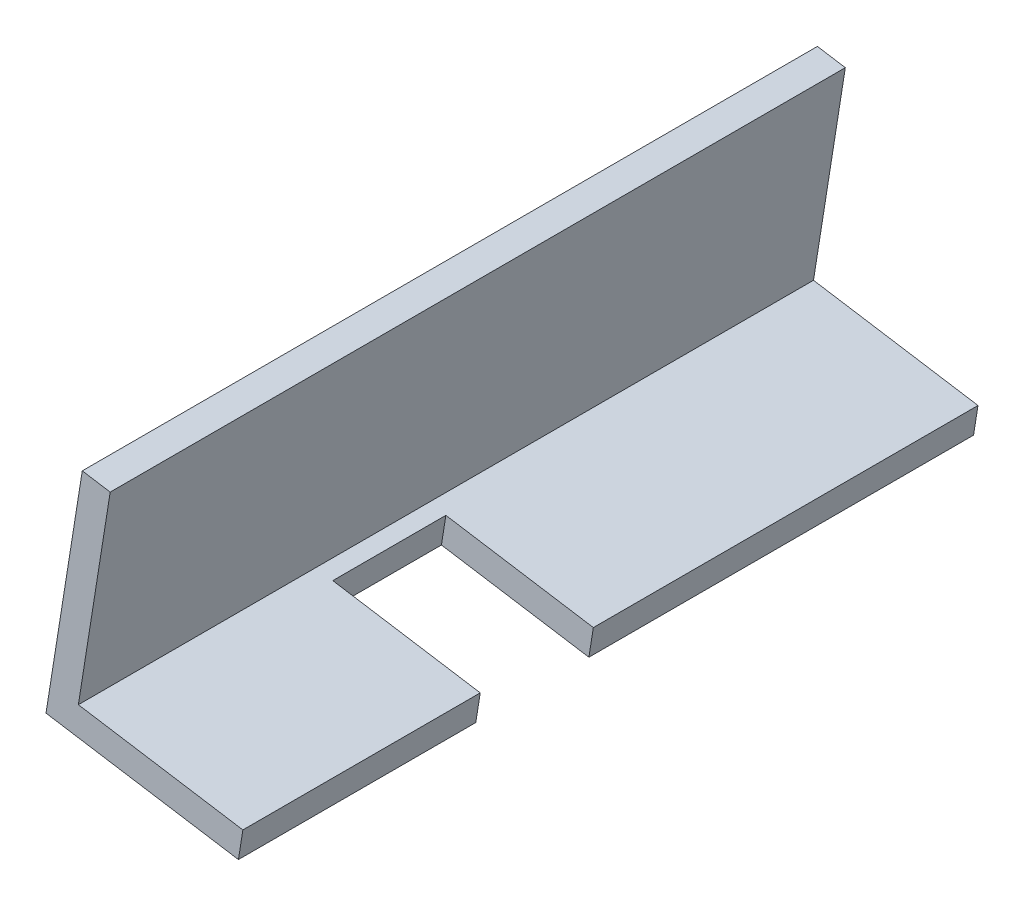
ISO-10303-21;
HEADER;
FILE_DESCRIPTION(('STEP AP214'),'2;1');
FILE_NAME('part.step','',(''),(''),'','','');
FILE_SCHEMA(('AUTOMOTIVE_DESIGN { 1 0 10303 214 1 1 1 1 }'));
ENDSEC;
DATA;
#1=APPLICATION_CONTEXT('core data for automotive mechanical design processes');
#2=APPLICATION_PROTOCOL_DEFINITION('international standard','automotive_design',2000,#1);
#3=PRODUCT_CONTEXT('',#1,'mechanical');
#4=PRODUCT('Part','Part','',(#3));
#5=PRODUCT_RELATED_PRODUCT_CATEGORY('part','',(#4));
#6=PRODUCT_DEFINITION_FORMATION('','',#4);
#7=PRODUCT_DEFINITION_CONTEXT('part definition',#1,'design');
#8=PRODUCT_DEFINITION('design','',#6,#7);
#9=PRODUCT_DEFINITION_SHAPE('','',#8);
#10=(LENGTH_UNIT() NAMED_UNIT(*) SI_UNIT(.MILLI.,.METRE.));
#11=(NAMED_UNIT(*) PLANE_ANGLE_UNIT() SI_UNIT($,.RADIAN.));
#12=(NAMED_UNIT(*) SI_UNIT($,.STERADIAN.) SOLID_ANGLE_UNIT());
#13=UNCERTAINTY_MEASURE_WITH_UNIT(LENGTH_MEASURE(1.E-05),#10,'distance_accuracy_value','');
#14=(GEOMETRIC_REPRESENTATION_CONTEXT(3) GLOBAL_UNCERTAINTY_ASSIGNED_CONTEXT((#13)) GLOBAL_UNIT_ASSIGNED_CONTEXT((#10,
#11,#12)) REPRESENTATION_CONTEXT('',''));
#15=CARTESIAN_POINT('',(0.,0.,0.));
#16=DIRECTION('',(0.,0.,1.));
#17=DIRECTION('',(1.,0.,0.));
#18=AXIS2_PLACEMENT_3D('',#15,#16,#17);
#19=CARTESIAN_POINT('',(160.5405547536,279.039764938732,165.1));
#20=DIRECTION('',(0.987580260945618,-0.15711533404027,0.));
#21=DIRECTION('',(0.15711533404027,0.987580260945618,0.));
#22=AXIS2_PLACEMENT_3D('',#19,#20,#21);
#23=PLANE('',#22);
#24=DIRECTION('',(0.15711533404027,0.987580260945618,0.));
#25=VECTOR('',#24,1.);
#26=CARTESIAN_POINT('',(160.5405547536,279.039764938732,111.788343442431));
#27=LINE('',#26,#25);
#28=CARTESIAN_POINT('',(160.5405547536,279.039764938732,111.788343442431));
#29=VERTEX_POINT('',#28);
#30=CARTESIAN_POINT('',(161.538237124756,285.310899595737,111.788343442431));
#31=VERTEX_POINT('',#30);
#32=EDGE_CURVE('E11',#29,#31,#27,.T.);
#33=ORIENTED_EDGE('',*,*,#32,.T.);
#34=DIRECTION('',(0.,0.,-1.));
#35=VECTOR('',#34,1.);
#36=CARTESIAN_POINT('',(161.538237124756,285.310899595737,165.1));
#37=LINE('',#36,#35);
#38=CARTESIAN_POINT('',(161.538237124756,285.310899595737,165.1));
#39=VERTEX_POINT('',#38);
#40=EDGE_CURVE('E160',#39,#31,#37,.T.);
#41=ORIENTED_EDGE('',*,*,#40,.F.);
#42=DIRECTION('',(0.15711533404027,0.987580260945618,0.));
#43=VECTOR('',#42,1.);
#44=CARTESIAN_POINT('',(160.5405547536,279.039764938732,165.1));
#45=LINE('',#44,#43);
#46=CARTESIAN_POINT('',(160.5405547536,279.039764938732,165.1));
#47=VERTEX_POINT('',#46);
#48=EDGE_CURVE('E213',#47,#39,#45,.T.);
#49=ORIENTED_EDGE('',*,*,#48,.F.);
#50=DIRECTION('',(0.,0.,-1.));
#51=VECTOR('',#50,1.);
#52=CARTESIAN_POINT('',(160.5405547536,279.039764938732,165.1));
#53=LINE('',#52,#51);
#54=EDGE_CURVE('E164',#47,#29,#53,.T.);
#55=ORIENTED_EDGE('',*,*,#54,.T.);
#56=EDGE_LOOP('',(#33,#41,#49,#55));
#57=FACE_BOUND('',#56,.T.);
#58=ADVANCED_FACE('F37',(#57),#23,.T.);
#59=CARTESIAN_POINT('',(117.323698160328,285.91518674326,165.1));
#60=DIRECTION('',(-0.157115334040368,-0.987580260945602,0.));
#61=DIRECTION('',(0.987580260945602,-0.157115334040368,0.));
#62=AXIS2_PLACEMENT_3D('',#59,#60,#61);
#63=PLANE('',#62);
#64=DIRECTION('',(0.987580260945602,-0.157115334040368,0.));
#65=VECTOR('',#64,1.);
#66=CARTESIAN_POINT('',(117.323698160328,285.91518674326,111.788343442431));
#67=LINE('',#66,#65);
#68=CARTESIAN_POINT('',(127.420136774103,284.308932154997,111.788343442431));
#69=VERTEX_POINT('',#68);
#70=EDGE_CURVE('E185',#69,#29,#67,.T.);
#71=ORIENTED_EDGE('',*,*,#70,.T.);
#72=ORIENTED_EDGE('',*,*,#54,.F.);
#73=DIRECTION('',(0.987580260945602,-0.157115334040368,0.));
#74=VECTOR('',#73,1.);
#75=CARTESIAN_POINT('',(117.323698160328,285.91518674326,165.1));
#76=LINE('',#75,#74);
#77=CARTESIAN_POINT('',(117.323698160328,285.91518674326,165.1));
#78=VERTEX_POINT('',#77);
#79=EDGE_CURVE('E96',#78,#47,#76,.T.);
#80=ORIENTED_EDGE('',*,*,#79,.F.);
#81=DIRECTION('',(0.,0.,-1.));
#82=VECTOR('',#81,1.);
#83=CARTESIAN_POINT('',(117.323698160328,285.91518674326,165.1));
#84=LINE('',#83,#82);
#85=CARTESIAN_POINT('',(117.323698160328,285.91518674326,0.));
#86=VERTEX_POINT('',#85);
#87=EDGE_CURVE('E152',#78,#86,#84,.T.);
#88=ORIENTED_EDGE('',*,*,#87,.T.);
#89=DIRECTION('',(0.987580260945602,-0.157115334040368,0.));
#90=VECTOR('',#89,1.);
#91=CARTESIAN_POINT('',(117.323698160328,285.91518674326,0.));
#92=LINE('',#91,#90);
#93=CARTESIAN_POINT('',(160.5405547536,279.039764938732,0.));
#94=VERTEX_POINT('',#93);
#95=EDGE_CURVE('E138',#86,#94,#92,.T.);
#96=ORIENTED_EDGE('',*,*,#95,.T.);
#97=CARTESIAN_POINT('',(160.5405547536,279.039764938732,86.3883434424306));
#98=VERTEX_POINT('',#97);
#99=EDGE_CURVE('E134',#98,#94,#53,.T.);
#100=ORIENTED_EDGE('',*,*,#99,.F.);
#101=DIRECTION('',(-0.987580260945602,0.157115334040368,0.));
#102=VECTOR('',#101,1.);
#103=CARTESIAN_POINT('',(117.323698160328,285.91518674326,86.3883434424306));
#104=LINE('',#103,#102);
#105=CARTESIAN_POINT('',(127.420136774103,284.308932154997,86.3883434424306));
#106=VERTEX_POINT('',#105);
#107=EDGE_CURVE('E178',#98,#106,#104,.T.);
#108=ORIENTED_EDGE('',*,*,#107,.T.);
#109=DIRECTION('',(0.,0.,1.));
#110=VECTOR('',#109,1.);
#111=CARTESIAN_POINT('',(127.420136774103,284.308932154997,165.1));
#112=LINE('',#111,#110);
#113=EDGE_CURVE('E142',#106,#69,#112,.T.);
#114=ORIENTED_EDGE('',*,*,#113,.T.);
#115=EDGE_LOOP('',(#71,#72,#80,#88,#96,#100,#108,#114));
#116=FACE_BOUND('',#115,.T.);
#117=ADVANCED_FACE('F39',(#116),#63,.T.);
#118=CARTESIAN_POINT('',(118.321582589616,292.186289254593,165.1));
#119=DIRECTION('',(-0.987575198122469,0.157147154137024,0.));
#120=DIRECTION('',(-0.157147154137024,-0.987575198122469,0.));
#121=AXIS2_PLACEMENT_3D('',#118,#119,#120);
#122=PLANE('',#121);
#123=DIRECTION('',(-0.157147154137024,-0.987575198122469,0.));
#124=VECTOR('',#123,1.);
#125=CARTESIAN_POINT('',(118.321582589616,292.186289254593,0.));
#126=LINE('',#125,#124);
#127=CARTESIAN_POINT('',(118.321582589616,292.186289254593,0.));
#128=VERTEX_POINT('',#127);
#129=EDGE_CURVE('E90',#128,#86,#126,.T.);
#130=ORIENTED_EDGE('',*,*,#129,.T.);
#131=ORIENTED_EDGE('',*,*,#87,.F.);
#132=DIRECTION('',(-0.157147154137024,-0.987575198122469,0.));
#133=VECTOR('',#132,1.);
#134=CARTESIAN_POINT('',(118.321582589616,292.186289254593,165.1));
#135=LINE('',#134,#133);
#136=CARTESIAN_POINT('',(118.321582589616,292.186289254593,165.1));
#137=VERTEX_POINT('',#136);
#138=EDGE_CURVE('E60',#137,#78,#135,.T.);
#139=ORIENTED_EDGE('',*,*,#138,.F.);
#140=DIRECTION('',(0.,0.,-1.));
#141=VECTOR('',#140,1.);
#142=CARTESIAN_POINT('',(118.321582589616,292.186289254593,165.1));
#143=LINE('',#142,#141);
#144=EDGE_CURVE('E129',#137,#128,#143,.T.);
#145=ORIENTED_EDGE('',*,*,#144,.T.);
#146=EDGE_LOOP('',(#130,#131,#139,#145));
#147=FACE_BOUND('',#146,.T.);
#148=ADVANCED_FACE('F220',(#147),#122,.T.);
#149=CARTESIAN_POINT('',(125.469495965379,337.114644597921,165.1));
#150=DIRECTION('',(-0.987579554334892,0.157119775520765,0.));
#151=DIRECTION('',(-0.157119775520765,-0.987579554334892,0.));
#152=AXIS2_PLACEMENT_3D('',#149,#150,#151);
#153=PLANE('',#152);
#154=DIRECTION('',(-0.157119775520765,-0.987579554334892,0.));
#155=VECTOR('',#154,1.);
#156=CARTESIAN_POINT('',(125.469495965379,337.114644597921,0.));
#157=LINE('',#156,#155);
#158=CARTESIAN_POINT('',(125.469495965379,337.114644597921,0.));
#159=VERTEX_POINT('',#158);
#160=EDGE_CURVE('E149',#159,#128,#157,.T.);
#161=ORIENTED_EDGE('',*,*,#160,.T.);
#162=ORIENTED_EDGE('',*,*,#144,.F.);
#163=DIRECTION('',(-0.157119775520765,-0.987579554334892,0.));
#164=VECTOR('',#163,1.);
#165=CARTESIAN_POINT('',(125.469495965379,337.114644597921,165.1));
#166=LINE('',#165,#164);
#167=CARTESIAN_POINT('',(125.469495965379,337.114644597921,165.1));
#168=VERTEX_POINT('',#167);
#169=EDGE_CURVE('E114',#168,#137,#166,.T.);
#170=ORIENTED_EDGE('',*,*,#169,.F.);
#171=DIRECTION('',(0.,0.,-1.));
#172=VECTOR('',#171,1.);
#173=CARTESIAN_POINT('',(125.469495965379,337.114644597921,165.1));
#174=LINE('',#173,#172);
#175=EDGE_CURVE('E123',#168,#159,#174,.T.);
#176=ORIENTED_EDGE('',*,*,#175,.T.);
#177=EDGE_LOOP('',(#161,#162,#170,#176));
#178=FACE_BOUND('',#177,.T.);
#179=ADVANCED_FACE('F132',(#178),#153,.T.);
#180=CARTESIAN_POINT('',(131.740630622384,336.116962226764,165.1));
#181=DIRECTION('',(0.157115334040352,0.987580260945605,0.));
#182=DIRECTION('',(-0.987580260945605,0.157115334040352,0.));
#183=AXIS2_PLACEMENT_3D('',#180,#181,#182);
#184=PLANE('',#183);
#185=DIRECTION('',(-0.987580260945605,0.157115334040352,0.));
#186=VECTOR('',#185,1.);
#187=CARTESIAN_POINT('',(131.740630622384,336.116962226764,0.));
#188=LINE('',#187,#186);
#189=CARTESIAN_POINT('',(131.740630622384,336.116962226764,0.));
#190=VERTEX_POINT('',#189);
#191=EDGE_CURVE('E126',#190,#159,#188,.T.);
#192=ORIENTED_EDGE('',*,*,#191,.T.);
#193=ORIENTED_EDGE('',*,*,#175,.F.);
#194=DIRECTION('',(-0.987580260945605,0.157115334040352,0.));
#195=VECTOR('',#194,1.);
#196=CARTESIAN_POINT('',(131.740630622384,336.116962226764,165.1));
#197=LINE('',#196,#195);
#198=CARTESIAN_POINT('',(131.740630622384,336.116962226764,165.1));
#199=VERTEX_POINT('',#198);
#200=EDGE_CURVE('E110',#199,#168,#197,.T.);
#201=ORIENTED_EDGE('',*,*,#200,.F.);
#202=DIRECTION('',(0.,0.,-1.));
#203=VECTOR('',#202,1.);
#204=CARTESIAN_POINT('',(131.740630622384,336.116962226764,165.1));
#205=LINE('',#204,#203);
#206=EDGE_CURVE('E130',#199,#190,#205,.T.);
#207=ORIENTED_EDGE('',*,*,#206,.T.);
#208=EDGE_LOOP('',(#192,#193,#201,#207));
#209=FACE_BOUND('',#208,.T.);
#210=ADVANCED_FACE('F124',(#209),#184,.T.);
#211=CARTESIAN_POINT('',(124.592919304753,291.188574737765,165.1));
#212=DIRECTION('',(0.987580260945597,-0.157115334040398,0.));
#213=DIRECTION('',(0.157115334040398,0.987580260945598,0.));
#214=AXIS2_PLACEMENT_3D('',#211,#212,#213);
#215=PLANE('',#214);
#216=DIRECTION('',(0.157115334040398,0.987580260945597,0.));
#217=VECTOR('',#216,1.);
#218=CARTESIAN_POINT('',(124.592919304753,291.188574737765,0.));
#219=LINE('',#218,#217);
#220=CARTESIAN_POINT('',(124.592919304753,291.188574737765,0.));
#221=VERTEX_POINT('',#220);
#222=EDGE_CURVE('E146',#221,#190,#219,.T.);
#223=ORIENTED_EDGE('',*,*,#222,.T.);
#224=ORIENTED_EDGE('',*,*,#206,.F.);
#225=DIRECTION('',(0.157115334040398,0.987580260945597,0.));
#226=VECTOR('',#225,1.);
#227=CARTESIAN_POINT('',(124.592919304753,291.188574737765,165.1));
#228=LINE('',#227,#226);
#229=CARTESIAN_POINT('',(124.592919304753,291.188574737765,165.1));
#230=VERTEX_POINT('',#229);
#231=EDGE_CURVE('E117',#230,#199,#228,.T.);
#232=ORIENTED_EDGE('',*,*,#231,.F.);
#233=DIRECTION('',(0.,0.,-1.));
#234=VECTOR('',#233,1.);
#235=CARTESIAN_POINT('',(124.592919304753,291.188574737765,165.1));
#236=LINE('',#235,#234);
#237=EDGE_CURVE('E157',#230,#221,#236,.T.);
#238=ORIENTED_EDGE('',*,*,#237,.T.);
#239=EDGE_LOOP('',(#223,#224,#232,#238));
#240=FACE_BOUND('',#239,.T.);
#241=ADVANCED_FACE('F219',(#240),#215,.T.);
#242=CARTESIAN_POINT('',(161.538237124756,285.310899595737,165.1));
#243=DIRECTION('',(0.157115334040372,0.987580260945601,0.));
#244=DIRECTION('',(-0.987580260945601,0.157115334040372,0.));
#245=AXIS2_PLACEMENT_3D('',#242,#243,#244);
#246=PLANE('',#245);
#247=DIRECTION('',(-0.987580260945602,0.157115334040372,0.));
#248=VECTOR('',#247,1.);
#249=CARTESIAN_POINT('',(128.41781914526,290.580066812002,111.788343442431));
#250=LINE('',#249,#248);
#251=CARTESIAN_POINT('',(128.41781914526,290.580066812002,111.788343442431));
#252=VERTEX_POINT('',#251);
#253=EDGE_CURVE('E202',#31,#252,#250,.T.);
#254=ORIENTED_EDGE('',*,*,#253,.T.);
#255=DIRECTION('',(0.,0.,-1.));
#256=VECTOR('',#255,1.);
#257=CARTESIAN_POINT('',(128.41781914526,290.580066812002,111.788343442431));
#258=LINE('',#257,#256);
#259=CARTESIAN_POINT('',(128.41781914526,290.580066812002,86.3883434424306));
#260=VERTEX_POINT('',#259);
#261=EDGE_CURVE('E201',#252,#260,#258,.T.);
#262=ORIENTED_EDGE('',*,*,#261,.T.);
#263=DIRECTION('',(0.987580260945602,-0.157115334040372,0.));
#264=VECTOR('',#263,1.);
#265=CARTESIAN_POINT('',(128.41781914526,290.580066812002,86.3883434424306));
#266=LINE('',#265,#264);
#267=CARTESIAN_POINT('',(161.538237124756,285.310899595737,86.3883434424306));
#268=VERTEX_POINT('',#267);
#269=EDGE_CURVE('E198',#260,#268,#266,.T.);
#270=ORIENTED_EDGE('',*,*,#269,.T.);
#271=CARTESIAN_POINT('',(161.538237124756,285.310899595737,0.));
#272=VERTEX_POINT('',#271);
#273=EDGE_CURVE('E163',#268,#272,#37,.T.);
#274=ORIENTED_EDGE('',*,*,#273,.T.);
#275=DIRECTION('',(-0.987580260945602,0.157115334040372,0.));
#276=VECTOR('',#275,1.);
#277=CARTESIAN_POINT('',(161.538237124756,285.310899595737,0.));
#278=LINE('',#277,#276);
#279=EDGE_CURVE('E144',#272,#221,#278,.T.);
#280=ORIENTED_EDGE('',*,*,#279,.T.);
#281=ORIENTED_EDGE('',*,*,#237,.F.);
#282=DIRECTION('',(-0.987580260945602,0.157115334040372,0.));
#283=VECTOR('',#282,1.);
#284=CARTESIAN_POINT('',(161.538237124756,285.310899595737,165.1));
#285=LINE('',#284,#283);
#286=EDGE_CURVE('E215',#39,#230,#285,.T.);
#287=ORIENTED_EDGE('',*,*,#286,.F.);
#288=ORIENTED_EDGE('',*,*,#40,.T.);
#289=EDGE_LOOP('',(#254,#262,#270,#274,#280,#281,#287,#288));
#290=FACE_BOUND('',#289,.T.);
#291=ADVANCED_FACE('F196',(#290),#246,.T.);
#292=DIRECTION('',(-0.15711533404027,-0.987580260945618,0.));
#293=VECTOR('',#292,1.);
#294=CARTESIAN_POINT('',(160.5405547536,279.039764938732,86.3883434424306));
#295=LINE('',#294,#293);
#296=EDGE_CURVE('E45',#268,#98,#295,.T.);
#297=ORIENTED_EDGE('',*,*,#296,.T.);
#298=ORIENTED_EDGE('',*,*,#99,.T.);
#299=DIRECTION('',(0.15711533404027,0.987580260945618,0.));
#300=VECTOR('',#299,1.);
#301=CARTESIAN_POINT('',(160.5405547536,279.039764938732,0.));
#302=LINE('',#301,#300);
#303=EDGE_CURVE('E141',#94,#272,#302,.T.);
#304=ORIENTED_EDGE('',*,*,#303,.T.);
#305=ORIENTED_EDGE('',*,*,#273,.F.);
#306=EDGE_LOOP('',(#297,#298,#304,#305));
#307=FACE_BOUND('',#306,.T.);
#308=ADVANCED_FACE('F169',(#307),#23,.T.);
#309=CARTESIAN_POINT('',(160.5405547536,279.039764938732,165.1));
#310=DIRECTION('',(0.,0.,-1.));
#311=DIRECTION('',(1.,0.,0.));
#312=AXIS2_PLACEMENT_3D('',#309,#310,#311);
#313=PLANE('',#312);
#314=ORIENTED_EDGE('',*,*,#79,.T.);
#315=ORIENTED_EDGE('',*,*,#48,.T.);
#316=ORIENTED_EDGE('',*,*,#286,.T.);
#317=ORIENTED_EDGE('',*,*,#231,.T.);
#318=ORIENTED_EDGE('',*,*,#200,.T.);
#319=ORIENTED_EDGE('',*,*,#169,.T.);
#320=ORIENTED_EDGE('',*,*,#138,.T.);
#321=EDGE_LOOP('',(#314,#315,#316,#317,#318,#319,#320));
#322=FACE_BOUND('',#321,.T.);
#323=ADVANCED_FACE('F112',(#322),#313,.F.);
#324=CARTESIAN_POINT('',(160.5405547536,279.039764938732,0.));
#325=DIRECTION('',(0.,0.,-1.));
#326=DIRECTION('',(1.,0.,0.));
#327=AXIS2_PLACEMENT_3D('',#324,#325,#326);
#328=PLANE('',#327);
#329=ORIENTED_EDGE('',*,*,#95,.F.);
#330=ORIENTED_EDGE('',*,*,#129,.F.);
#331=ORIENTED_EDGE('',*,*,#160,.F.);
#332=ORIENTED_EDGE('',*,*,#191,.F.);
#333=ORIENTED_EDGE('',*,*,#222,.F.);
#334=ORIENTED_EDGE('',*,*,#279,.F.);
#335=ORIENTED_EDGE('',*,*,#303,.F.);
#336=EDGE_LOOP('',(#329,#330,#331,#332,#333,#334,#335));
#337=FACE_BOUND('',#336,.T.);
#338=ADVANCED_FACE('F190',(#337),#328,.T.);
#339=CARTESIAN_POINT('',(126.353318807417,277.603231706621,111.788343442431));
#340=DIRECTION('',(-0.987580260945601,0.157115334040372,0.));
#341=DIRECTION('',(-0.157115334040372,-0.987580260945602,0.));
#342=AXIS2_PLACEMENT_3D('',#339,#340,#341);
#343=PLANE('',#342);
#344=ORIENTED_EDGE('',*,*,#113,.F.);
#345=DIRECTION('',(0.157115334040372,0.987580260945601,0.));
#346=VECTOR('',#345,1.);
#347=CARTESIAN_POINT('',(126.353318807417,277.603231706621,86.3883434424306));
#348=LINE('',#347,#346);
#349=EDGE_CURVE('E181',#106,#260,#348,.T.);
#350=ORIENTED_EDGE('',*,*,#349,.T.);
#351=ORIENTED_EDGE('',*,*,#261,.F.);
#352=DIRECTION('',(0.157115334040372,0.987580260945601,0.));
#353=VECTOR('',#352,1.);
#354=CARTESIAN_POINT('',(126.353318807417,277.603231706621,111.788343442431));
#355=LINE('',#354,#353);
#356=EDGE_CURVE('E186',#69,#252,#355,.T.);
#357=ORIENTED_EDGE('',*,*,#356,.F.);
#358=EDGE_LOOP('',(#344,#350,#351,#357));
#359=FACE_BOUND('',#358,.T.);
#360=ADVANCED_FACE('F234',(#359),#343,.F.);
#361=CARTESIAN_POINT('',(126.353318807417,277.603231706621,111.788343442431));
#362=DIRECTION('',(0.,0.,1.));
#363=DIRECTION('',(-1.,0.,0.));
#364=AXIS2_PLACEMENT_3D('',#361,#362,#363);
#365=PLANE('',#364);
#366=ORIENTED_EDGE('',*,*,#70,.F.);
#367=ORIENTED_EDGE('',*,*,#356,.T.);
#368=ORIENTED_EDGE('',*,*,#253,.F.);
#369=ORIENTED_EDGE('',*,*,#32,.F.);
#370=EDGE_LOOP('',(#366,#367,#368,#369));
#371=FACE_BOUND('',#370,.T.);
#372=ADVANCED_FACE('F235',(#371),#365,.F.);
#373=CARTESIAN_POINT('',(126.353318807417,277.603231706621,86.3883434424306));
#374=DIRECTION('',(0.,0.,-1.));
#375=DIRECTION('',(1.,0.,0.));
#376=AXIS2_PLACEMENT_3D('',#373,#374,#375);
#377=PLANE('',#376);
#378=ORIENTED_EDGE('',*,*,#107,.F.);
#379=ORIENTED_EDGE('',*,*,#296,.F.);
#380=ORIENTED_EDGE('',*,*,#269,.F.);
#381=ORIENTED_EDGE('',*,*,#349,.F.);
#382=EDGE_LOOP('',(#378,#379,#380,#381));
#383=FACE_BOUND('',#382,.T.);
#384=ADVANCED_FACE('F179',(#383),#377,.F.);
#385=CLOSED_SHELL('',(#58,#117,#148,#179,#210,#241,#291,#308,#323,#338,#360,#372,#384));
#386=MANIFOLD_SOLID_BREP('B2',#385);
#387=ADVANCED_BREP_SHAPE_REPRESENTATION('',(#18,#386),#14);
#388=SHAPE_DEFINITION_REPRESENTATION(#9,#387);
ENDSEC;
END-ISO-10303-21;
